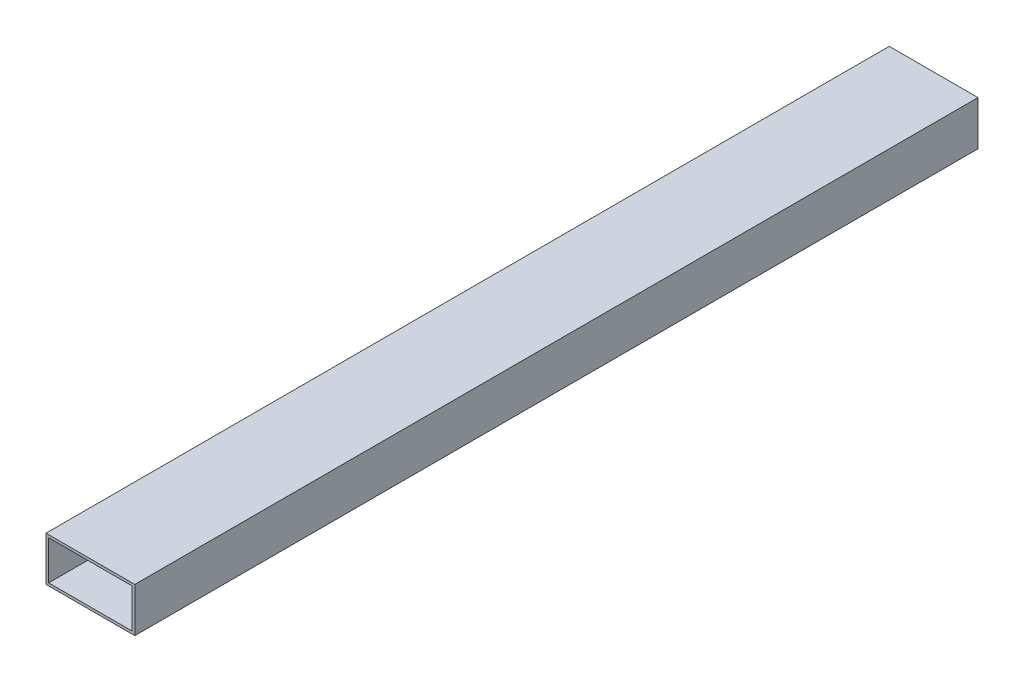
ISO-10303-21;
HEADER;
FILE_DESCRIPTION(('STEP AP214'),'2;1');
FILE_NAME('part.step','',(''),(''),'','','');
FILE_SCHEMA(('AUTOMOTIVE_DESIGN { 1 0 10303 214 1 1 1 1 }'));
ENDSEC;
DATA;
#1=APPLICATION_CONTEXT('core data for automotive mechanical design processes');
#2=APPLICATION_PROTOCOL_DEFINITION('international standard','automotive_design',2000,#1);
#3=PRODUCT_CONTEXT('',#1,'mechanical');
#4=PRODUCT('Part','Part','',(#3));
#5=PRODUCT_RELATED_PRODUCT_CATEGORY('part','',(#4));
#6=PRODUCT_DEFINITION_FORMATION('','',#4);
#7=PRODUCT_DEFINITION_CONTEXT('part definition',#1,'design');
#8=PRODUCT_DEFINITION('design','',#6,#7);
#9=PRODUCT_DEFINITION_SHAPE('','',#8);
#10=(LENGTH_UNIT() NAMED_UNIT(*) SI_UNIT(.MILLI.,.METRE.));
#11=(NAMED_UNIT(*) PLANE_ANGLE_UNIT() SI_UNIT($,.RADIAN.));
#12=(NAMED_UNIT(*) SI_UNIT($,.STERADIAN.) SOLID_ANGLE_UNIT());
#13=UNCERTAINTY_MEASURE_WITH_UNIT(LENGTH_MEASURE(1.E-05),#10,'distance_accuracy_value','');
#14=(GEOMETRIC_REPRESENTATION_CONTEXT(3) GLOBAL_UNCERTAINTY_ASSIGNED_CONTEXT((#13)) GLOBAL_UNIT_ASSIGNED_CONTEXT((#10,
#11,#12)) REPRESENTATION_CONTEXT('',''));
#15=CARTESIAN_POINT('',(0.,0.,0.));
#16=DIRECTION('',(0.,0.,1.));
#17=DIRECTION('',(1.,0.,0.));
#18=AXIS2_PLACEMENT_3D('',#15,#16,#17);
#19=CARTESIAN_POINT('',(0.,0.,482.6));
#20=DIRECTION('',(0.,0.,1.));
#21=DIRECTION('',(1.,0.,0.));
#22=AXIS2_PLACEMENT_3D('',#19,#20,#21);
#23=PLANE('',#22);
#24=DIRECTION('',(0.,1.,0.));
#25=VECTOR('',#24,1.);
#26=CARTESIAN_POINT('',(0.,0.,482.6));
#27=LINE('',#26,#25);
#28=CARTESIAN_POINT('',(0.,0.,482.6));
#29=VERTEX_POINT('',#28);
#30=CARTESIAN_POINT('',(0.,25.4,482.6));
#31=VERTEX_POINT('',#30);
#32=EDGE_CURVE('E177',#29,#31,#27,.T.);
#33=ORIENTED_EDGE('',*,*,#32,.T.);
#34=DIRECTION('',(-1.,0.,0.));
#35=VECTOR('',#34,1.);
#36=CARTESIAN_POINT('',(0.,25.4,482.6));
#37=LINE('',#36,#35);
#38=CARTESIAN_POINT('',(-50.8,25.4,482.6));
#39=VERTEX_POINT('',#38);
#40=EDGE_CURVE('E181',#31,#39,#37,.T.);
#41=ORIENTED_EDGE('',*,*,#40,.T.);
#42=DIRECTION('',(0.,-1.,0.));
#43=VECTOR('',#42,1.);
#44=CARTESIAN_POINT('',(-50.8,0.,482.6));
#45=LINE('',#44,#43);
#46=CARTESIAN_POINT('',(-50.8,0.,482.6));
#47=VERTEX_POINT('',#46);
#48=EDGE_CURVE('E185',#39,#47,#45,.T.);
#49=ORIENTED_EDGE('',*,*,#48,.T.);
#50=DIRECTION('',(1.,0.,0.));
#51=VECTOR('',#50,1.);
#52=CARTESIAN_POINT('',(0.,0.,482.6));
#53=LINE('',#52,#51);
#54=EDGE_CURVE('E188',#47,#29,#53,.T.);
#55=ORIENTED_EDGE('',*,*,#54,.T.);
#56=EDGE_LOOP('',(#33,#41,#49,#55));
#57=FACE_BOUND('',#56,.T.);
#58=DIRECTION('',(-1.,0.,0.));
#59=VECTOR('',#58,1.);
#60=CARTESIAN_POINT('',(0.,23.876,482.6));
#61=LINE('',#60,#59);
#62=CARTESIAN_POINT('',(-1.524,23.876,482.6));
#63=VERTEX_POINT('',#62);
#64=CARTESIAN_POINT('',(-49.276,23.876,482.6));
#65=VERTEX_POINT('',#64);
#66=EDGE_CURVE('E138',#63,#65,#61,.T.);
#67=ORIENTED_EDGE('',*,*,#66,.F.);
#68=DIRECTION('',(0.,1.,0.));
#69=VECTOR('',#68,1.);
#70=CARTESIAN_POINT('',(-1.524,0.,482.6));
#71=LINE('',#70,#69);
#72=CARTESIAN_POINT('',(-1.524,1.524,482.6));
#73=VERTEX_POINT('',#72);
#74=EDGE_CURVE('E129',#73,#63,#71,.T.);
#75=ORIENTED_EDGE('',*,*,#74,.F.);
#76=DIRECTION('',(1.,0.,0.));
#77=VECTOR('',#76,1.);
#78=CARTESIAN_POINT('',(0.,1.524,482.6));
#79=LINE('',#78,#77);
#80=CARTESIAN_POINT('',(-49.276,1.524,482.6));
#81=VERTEX_POINT('',#80);
#82=EDGE_CURVE('E155',#81,#73,#79,.T.);
#83=ORIENTED_EDGE('',*,*,#82,.F.);
#84=DIRECTION('',(0.,-1.,0.));
#85=VECTOR('',#84,1.);
#86=CARTESIAN_POINT('',(-49.276,0.,482.6));
#87=LINE('',#86,#85);
#88=EDGE_CURVE('E151',#65,#81,#87,.T.);
#89=ORIENTED_EDGE('',*,*,#88,.F.);
#90=EDGE_LOOP('',(#67,#75,#83,#89));
#91=FACE_BOUND('',#90,.T.);
#92=ADVANCED_FACE('F63',(#57,#91),#23,.T.);
#93=CARTESIAN_POINT('',(0.,0.,0.));
#94=DIRECTION('',(0.,0.,1.));
#95=DIRECTION('',(1.,0.,0.));
#96=AXIS2_PLACEMENT_3D('',#93,#94,#95);
#97=PLANE('',#96);
#98=DIRECTION('',(0.,1.,0.));
#99=VECTOR('',#98,1.);
#100=CARTESIAN_POINT('',(0.,0.,0.));
#101=LINE('',#100,#99);
#102=CARTESIAN_POINT('',(0.,0.,0.));
#103=VERTEX_POINT('',#102);
#104=CARTESIAN_POINT('',(0.,25.4,0.));
#105=VERTEX_POINT('',#104);
#106=EDGE_CURVE('E147',#103,#105,#101,.T.);
#107=ORIENTED_EDGE('',*,*,#106,.F.);
#108=DIRECTION('',(1.,0.,0.));
#109=VECTOR('',#108,1.);
#110=CARTESIAN_POINT('',(0.,0.,0.));
#111=LINE('',#110,#109);
#112=CARTESIAN_POINT('',(-50.8,0.,0.));
#113=VERTEX_POINT('',#112);
#114=EDGE_CURVE('E182',#113,#103,#111,.T.);
#115=ORIENTED_EDGE('',*,*,#114,.F.);
#116=DIRECTION('',(0.,-1.,0.));
#117=VECTOR('',#116,1.);
#118=CARTESIAN_POINT('',(-50.8,0.,0.));
#119=LINE('',#118,#117);
#120=CARTESIAN_POINT('',(-50.8,25.4,0.));
#121=VERTEX_POINT('',#120);
#122=EDGE_CURVE('E198',#121,#113,#119,.T.);
#123=ORIENTED_EDGE('',*,*,#122,.F.);
#124=DIRECTION('',(-1.,0.,0.));
#125=VECTOR('',#124,1.);
#126=CARTESIAN_POINT('',(0.,25.4,0.));
#127=LINE('',#126,#125);
#128=EDGE_CURVE('E195',#105,#121,#127,.T.);
#129=ORIENTED_EDGE('',*,*,#128,.F.);
#130=EDGE_LOOP('',(#107,#115,#123,#129));
#131=FACE_BOUND('',#130,.T.);
#132=DIRECTION('',(0.,1.,0.));
#133=VECTOR('',#132,1.);
#134=CARTESIAN_POINT('',(-1.524,0.,0.));
#135=LINE('',#134,#133);
#136=CARTESIAN_POINT('',(-1.524,1.524,0.));
#137=VERTEX_POINT('',#136);
#138=CARTESIAN_POINT('',(-1.524,23.876,0.));
#139=VERTEX_POINT('',#138);
#140=EDGE_CURVE('E87',#137,#139,#135,.T.);
#141=ORIENTED_EDGE('',*,*,#140,.T.);
#142=DIRECTION('',(-1.,0.,0.));
#143=VECTOR('',#142,1.);
#144=CARTESIAN_POINT('',(0.,23.876,0.));
#145=LINE('',#144,#143);
#146=CARTESIAN_POINT('',(-49.276,23.876,0.));
#147=VERTEX_POINT('',#146);
#148=EDGE_CURVE('E145',#139,#147,#145,.T.);
#149=ORIENTED_EDGE('',*,*,#148,.T.);
#150=DIRECTION('',(0.,-1.,0.));
#151=VECTOR('',#150,1.);
#152=CARTESIAN_POINT('',(-49.276,0.,0.));
#153=LINE('',#152,#151);
#154=CARTESIAN_POINT('',(-49.276,1.524,0.));
#155=VERTEX_POINT('',#154);
#156=EDGE_CURVE('E164',#147,#155,#153,.T.);
#157=ORIENTED_EDGE('',*,*,#156,.T.);
#158=DIRECTION('',(1.,0.,0.));
#159=VECTOR('',#158,1.);
#160=CARTESIAN_POINT('',(0.,1.524,0.));
#161=LINE('',#160,#159);
#162=EDGE_CURVE('E139',#155,#137,#161,.T.);
#163=ORIENTED_EDGE('',*,*,#162,.T.);
#164=EDGE_LOOP('',(#141,#149,#157,#163));
#165=FACE_BOUND('',#164,.T.);
#166=ADVANCED_FACE('F221',(#131,#165),#97,.F.);
#167=CARTESIAN_POINT('',(0.,0.,482.6));
#168=DIRECTION('',(-1.,0.,0.));
#169=DIRECTION('',(0.,-1.,0.));
#170=AXIS2_PLACEMENT_3D('',#167,#168,#169);
#171=PLANE('',#170);
#172=ORIENTED_EDGE('',*,*,#106,.T.);
#173=DIRECTION('',(0.,0.,-1.));
#174=VECTOR('',#173,1.);
#175=CARTESIAN_POINT('',(0.,25.4,482.6));
#176=LINE('',#175,#174);
#177=EDGE_CURVE('E12',#31,#105,#176,.T.);
#178=ORIENTED_EDGE('',*,*,#177,.F.);
#179=ORIENTED_EDGE('',*,*,#32,.F.);
#180=DIRECTION('',(0.,0.,-1.));
#181=VECTOR('',#180,1.);
#182=CARTESIAN_POINT('',(0.,0.,482.6));
#183=LINE('',#182,#181);
#184=EDGE_CURVE('E191',#29,#103,#183,.T.);
#185=ORIENTED_EDGE('',*,*,#184,.T.);
#186=EDGE_LOOP('',(#172,#178,#179,#185));
#187=FACE_BOUND('',#186,.T.);
#188=ADVANCED_FACE('F65',(#187),#171,.F.);
#189=CARTESIAN_POINT('',(0.,25.4,482.6));
#190=DIRECTION('',(0.,-1.,0.));
#191=DIRECTION('',(1.,0.,0.));
#192=AXIS2_PLACEMENT_3D('',#189,#190,#191);
#193=PLANE('',#192);
#194=ORIENTED_EDGE('',*,*,#128,.T.);
#195=DIRECTION('',(0.,0.,-1.));
#196=VECTOR('',#195,1.);
#197=CARTESIAN_POINT('',(-50.8,25.4,482.6));
#198=LINE('',#197,#196);
#199=EDGE_CURVE('E72',#39,#121,#198,.T.);
#200=ORIENTED_EDGE('',*,*,#199,.F.);
#201=ORIENTED_EDGE('',*,*,#40,.F.);
#202=ORIENTED_EDGE('',*,*,#177,.T.);
#203=EDGE_LOOP('',(#194,#200,#201,#202));
#204=FACE_BOUND('',#203,.T.);
#205=ADVANCED_FACE('F231',(#204),#193,.F.);
#206=CARTESIAN_POINT('',(-50.8,0.,482.6));
#207=DIRECTION('',(1.,0.,0.));
#208=DIRECTION('',(0.,0.,-1.));
#209=AXIS2_PLACEMENT_3D('',#206,#207,#208);
#210=PLANE('',#209);
#211=ORIENTED_EDGE('',*,*,#122,.T.);
#212=DIRECTION('',(0.,0.,-1.));
#213=VECTOR('',#212,1.);
#214=CARTESIAN_POINT('',(-50.8,0.,482.6));
#215=LINE('',#214,#213);
#216=EDGE_CURVE('E206',#47,#113,#215,.T.);
#217=ORIENTED_EDGE('',*,*,#216,.F.);
#218=ORIENTED_EDGE('',*,*,#48,.F.);
#219=ORIENTED_EDGE('',*,*,#199,.T.);
#220=EDGE_LOOP('',(#211,#217,#218,#219));
#221=FACE_BOUND('',#220,.T.);
#222=ADVANCED_FACE('F215',(#221),#210,.F.);
#223=CARTESIAN_POINT('',(0.,0.,482.6));
#224=DIRECTION('',(0.,1.,0.));
#225=DIRECTION('',(0.,0.,1.));
#226=AXIS2_PLACEMENT_3D('',#223,#224,#225);
#227=PLANE('',#226);
#228=ORIENTED_EDGE('',*,*,#114,.T.);
#229=ORIENTED_EDGE('',*,*,#184,.F.);
#230=ORIENTED_EDGE('',*,*,#54,.F.);
#231=ORIENTED_EDGE('',*,*,#216,.T.);
#232=EDGE_LOOP('',(#228,#229,#230,#231));
#233=FACE_BOUND('',#232,.T.);
#234=ADVANCED_FACE('F225',(#233),#227,.F.);
#235=CARTESIAN_POINT('',(-1.524,0.,482.6));
#236=DIRECTION('',(-1.,0.,0.));
#237=DIRECTION('',(0.,-1.,0.));
#238=AXIS2_PLACEMENT_3D('',#235,#236,#237);
#239=PLANE('',#238);
#240=ORIENTED_EDGE('',*,*,#140,.F.);
#241=DIRECTION('',(0.,0.,-1.));
#242=VECTOR('',#241,1.);
#243=CARTESIAN_POINT('',(-1.524,1.524,482.6));
#244=LINE('',#243,#242);
#245=EDGE_CURVE('E133',#73,#137,#244,.T.);
#246=ORIENTED_EDGE('',*,*,#245,.F.);
#247=ORIENTED_EDGE('',*,*,#74,.T.);
#248=DIRECTION('',(0.,0.,-1.));
#249=VECTOR('',#248,1.);
#250=CARTESIAN_POINT('',(-1.524,23.876,482.6));
#251=LINE('',#250,#249);
#252=EDGE_CURVE('E132',#63,#139,#251,.T.);
#253=ORIENTED_EDGE('',*,*,#252,.T.);
#254=EDGE_LOOP('',(#240,#246,#247,#253));
#255=FACE_BOUND('',#254,.T.);
#256=ADVANCED_FACE('F131',(#255),#239,.T.);
#257=CARTESIAN_POINT('',(0.,23.876,482.6));
#258=DIRECTION('',(0.,-1.,0.));
#259=DIRECTION('',(1.,0.,0.));
#260=AXIS2_PLACEMENT_3D('',#257,#258,#259);
#261=PLANE('',#260);
#262=ORIENTED_EDGE('',*,*,#148,.F.);
#263=ORIENTED_EDGE('',*,*,#252,.F.);
#264=ORIENTED_EDGE('',*,*,#66,.T.);
#265=DIRECTION('',(0.,0.,-1.));
#266=VECTOR('',#265,1.);
#267=CARTESIAN_POINT('',(-49.276,23.876,482.6));
#268=LINE('',#267,#266);
#269=EDGE_CURVE('E148',#65,#147,#268,.T.);
#270=ORIENTED_EDGE('',*,*,#269,.T.);
#271=EDGE_LOOP('',(#262,#263,#264,#270));
#272=FACE_BOUND('',#271,.T.);
#273=ADVANCED_FACE('F142',(#272),#261,.T.);
#274=CARTESIAN_POINT('',(-49.276,0.,482.6));
#275=DIRECTION('',(1.,0.,0.));
#276=DIRECTION('',(0.,0.,-1.));
#277=AXIS2_PLACEMENT_3D('',#274,#275,#276);
#278=PLANE('',#277);
#279=ORIENTED_EDGE('',*,*,#156,.F.);
#280=ORIENTED_EDGE('',*,*,#269,.F.);
#281=ORIENTED_EDGE('',*,*,#88,.T.);
#282=DIRECTION('',(0.,0.,-1.));
#283=VECTOR('',#282,1.);
#284=CARTESIAN_POINT('',(-49.276,1.524,482.6));
#285=LINE('',#284,#283);
#286=EDGE_CURVE('E79',#81,#155,#285,.T.);
#287=ORIENTED_EDGE('',*,*,#286,.T.);
#288=EDGE_LOOP('',(#279,#280,#281,#287));
#289=FACE_BOUND('',#288,.T.);
#290=ADVANCED_FACE('F254',(#289),#278,.T.);
#291=CARTESIAN_POINT('',(0.,1.524,482.6));
#292=DIRECTION('',(0.,1.,0.));
#293=DIRECTION('',(0.,0.,1.));
#294=AXIS2_PLACEMENT_3D('',#291,#292,#293);
#295=PLANE('',#294);
#296=ORIENTED_EDGE('',*,*,#162,.F.);
#297=ORIENTED_EDGE('',*,*,#286,.F.);
#298=ORIENTED_EDGE('',*,*,#82,.T.);
#299=ORIENTED_EDGE('',*,*,#245,.T.);
#300=EDGE_LOOP('',(#296,#297,#298,#299));
#301=FACE_BOUND('',#300,.T.);
#302=ADVANCED_FACE('F258',(#301),#295,.T.);
#303=CLOSED_SHELL('',(#92,#166,#188,#205,#222,#234,#256,#273,#290,#302));
#304=MANIFOLD_SOLID_BREP('B2',#303);
#305=ADVANCED_BREP_SHAPE_REPRESENTATION('',(#18,#304),#14);
#306=SHAPE_DEFINITION_REPRESENTATION(#9,#305);
ENDSEC;
END-ISO-10303-21;
